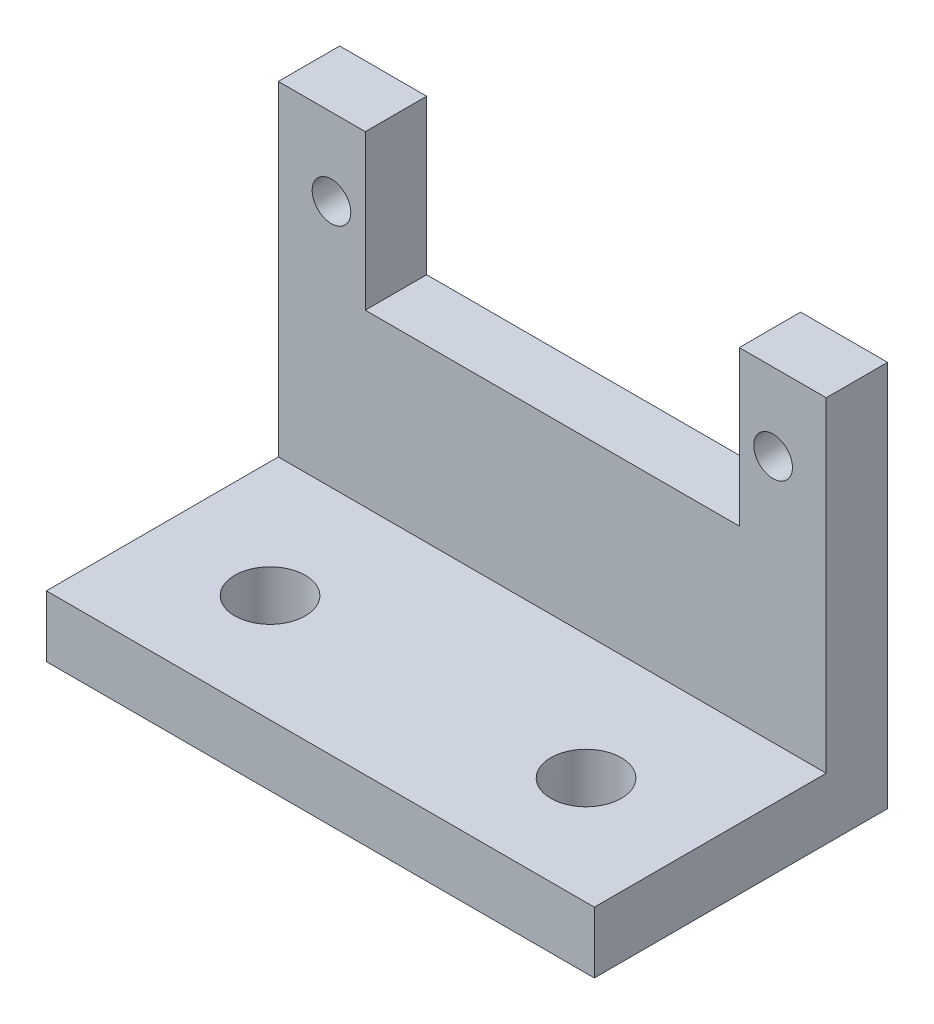
ISO-10303-21;
HEADER;
FILE_DESCRIPTION(('STEP AP214'),'2;1');
FILE_NAME('part.step','',(''),(''),'','','');
FILE_SCHEMA(('AUTOMOTIVE_DESIGN { 1 0 10303 214 1 1 1 1 }'));
ENDSEC;
DATA;
#1=APPLICATION_CONTEXT('core data for automotive mechanical design processes');
#2=APPLICATION_PROTOCOL_DEFINITION('international standard','automotive_design',2000,#1);
#3=PRODUCT_CONTEXT('',#1,'mechanical');
#4=PRODUCT('Part','Part','',(#3));
#5=PRODUCT_RELATED_PRODUCT_CATEGORY('part','',(#4));
#6=PRODUCT_DEFINITION_FORMATION('','',#4);
#7=PRODUCT_DEFINITION_CONTEXT('part definition',#1,'design');
#8=PRODUCT_DEFINITION('design','',#6,#7);
#9=PRODUCT_DEFINITION_SHAPE('','',#8);
#10=(LENGTH_UNIT() NAMED_UNIT(*) SI_UNIT(.MILLI.,.METRE.));
#11=(NAMED_UNIT(*) PLANE_ANGLE_UNIT() SI_UNIT($,.RADIAN.));
#12=(NAMED_UNIT(*) SI_UNIT($,.STERADIAN.) SOLID_ANGLE_UNIT());
#13=UNCERTAINTY_MEASURE_WITH_UNIT(LENGTH_MEASURE(1.E-05),#10,'distance_accuracy_value','');
#14=(GEOMETRIC_REPRESENTATION_CONTEXT(3) GLOBAL_UNCERTAINTY_ASSIGNED_CONTEXT((#13)) GLOBAL_UNIT_ASSIGNED_CONTEXT((#10,
#11,#12)) REPRESENTATION_CONTEXT('',''));
#15=CARTESIAN_POINT('',(0.,0.,0.));
#16=DIRECTION('',(0.,0.,1.));
#17=DIRECTION('',(1.,0.,0.));
#18=AXIS2_PLACEMENT_3D('',#15,#16,#17);
#19=CARTESIAN_POINT('',(0.,0.,3.175));
#20=DIRECTION('',(0.,0.,-1.));
#21=DIRECTION('',(-1.,0.,0.));
#22=AXIS2_PLACEMENT_3D('',#19,#20,#21);
#23=PLANE('',#22);
#24=CARTESIAN_POINT('',(25.6,4.,3.175));
#25=DIRECTION('',(0.,0.,1.));
#26=DIRECTION('',(1.,0.,0.));
#27=AXIS2_PLACEMENT_3D('',#24,#25,#26);
#28=CIRCLE('',#27,0.999999999999998);
#29=CARTESIAN_POINT('',(26.6,4.,3.175));
#30=VERTEX_POINT('',#29);
#31=EDGE_CURVE('E214',#30,#30,#28,.T.);
#32=ORIENTED_EDGE('',*,*,#31,.F.);
#33=EDGE_LOOP('',(#32));
#34=FACE_BOUND('',#33,.T.);
#35=CARTESIAN_POINT('',(2.75,4.,3.175));
#36=DIRECTION('',(0.,0.,1.));
#37=DIRECTION('',(1.,0.,0.));
#38=AXIS2_PLACEMENT_3D('',#35,#36,#37);
#39=CIRCLE('',#38,1.);
#40=CARTESIAN_POINT('',(3.75,4.,3.175));
#41=VERTEX_POINT('',#40);
#42=EDGE_CURVE('E139',#41,#41,#39,.T.);
#43=ORIENTED_EDGE('',*,*,#42,.F.);
#44=EDGE_LOOP('',(#43));
#45=FACE_BOUND('',#44,.T.);
#46=DIRECTION('',(-1.,0.,0.));
#47=VECTOR('',#46,1.);
#48=CARTESIAN_POINT('',(0.,-8.825,3.175));
#49=LINE('',#48,#47);
#50=CARTESIAN_POINT('',(28.35,-8.825,3.175));
#51=VERTEX_POINT('',#50);
#52=CARTESIAN_POINT('',(0.,-8.825,3.175));
#53=VERTEX_POINT('',#52);
#54=EDGE_CURVE('E50',#51,#53,#49,.T.);
#55=ORIENTED_EDGE('',*,*,#54,.F.);
#56=DIRECTION('',(0.,1.,0.));
#57=VECTOR('',#56,1.);
#58=CARTESIAN_POINT('',(28.35,8.,3.175));
#59=LINE('',#58,#57);
#60=CARTESIAN_POINT('',(28.35,8.,3.175));
#61=VERTEX_POINT('',#60);
#62=EDGE_CURVE('E165',#51,#61,#59,.T.);
#63=ORIENTED_EDGE('',*,*,#62,.T.);
#64=DIRECTION('',(-1.,0.,0.));
#65=VECTOR('',#64,1.);
#66=CARTESIAN_POINT('',(23.85,8.,3.175));
#67=LINE('',#66,#65);
#68=CARTESIAN_POINT('',(23.85,8.,3.175));
#69=VERTEX_POINT('',#68);
#70=EDGE_CURVE('E114',#61,#69,#67,.T.);
#71=ORIENTED_EDGE('',*,*,#70,.T.);
#72=DIRECTION('',(0.,-1.,0.));
#73=VECTOR('',#72,1.);
#74=CARTESIAN_POINT('',(23.85,0.,3.175));
#75=LINE('',#74,#73);
#76=CARTESIAN_POINT('',(23.85,0.,3.175));
#77=VERTEX_POINT('',#76);
#78=EDGE_CURVE('E108',#69,#77,#75,.T.);
#79=ORIENTED_EDGE('',*,*,#78,.T.);
#80=DIRECTION('',(-1.,0.,0.));
#81=VECTOR('',#80,1.);
#82=CARTESIAN_POINT('',(4.5,0.,3.175));
#83=LINE('',#82,#81);
#84=CARTESIAN_POINT('',(4.5,0.,3.175));
#85=VERTEX_POINT('',#84);
#86=EDGE_CURVE('E111',#77,#85,#83,.T.);
#87=ORIENTED_EDGE('',*,*,#86,.T.);
#88=DIRECTION('',(0.,1.,0.));
#89=VECTOR('',#88,1.);
#90=CARTESIAN_POINT('',(4.5,8.,3.175));
#91=LINE('',#90,#89);
#92=CARTESIAN_POINT('',(4.5,8.,3.175));
#93=VERTEX_POINT('',#92);
#94=EDGE_CURVE('E58',#85,#93,#91,.T.);
#95=ORIENTED_EDGE('',*,*,#94,.T.);
#96=DIRECTION('',(-1.,0.,0.));
#97=VECTOR('',#96,1.);
#98=CARTESIAN_POINT('',(0.,8.,3.175));
#99=LINE('',#98,#97);
#100=CARTESIAN_POINT('',(0.,8.,3.175));
#101=VERTEX_POINT('',#100);
#102=EDGE_CURVE('E151',#93,#101,#99,.T.);
#103=ORIENTED_EDGE('',*,*,#102,.T.);
#104=DIRECTION('',(0.,-1.,0.));
#105=VECTOR('',#104,1.);
#106=CARTESIAN_POINT('',(0.,8.,3.175));
#107=LINE('',#106,#105);
#108=EDGE_CURVE('E98',#101,#53,#107,.T.);
#109=ORIENTED_EDGE('',*,*,#108,.T.);
#110=EDGE_LOOP('',(#55,#63,#71,#79,#87,#95,#103,#109));
#111=FACE_BOUND('',#110,.T.);
#112=ADVANCED_FACE('F33',(#34,#45,#111),#23,.F.);
#113=CARTESIAN_POINT('',(0.,0.,0.));
#114=DIRECTION('',(0.,0.,-1.));
#115=DIRECTION('',(-1.,0.,0.));
#116=AXIS2_PLACEMENT_3D('',#113,#114,#115);
#117=PLANE('',#116);
#118=CARTESIAN_POINT('',(2.75,4.,0.));
#119=DIRECTION('',(0.,0.,1.));
#120=DIRECTION('',(1.,0.,0.));
#121=AXIS2_PLACEMENT_3D('',#118,#119,#120);
#122=CIRCLE('',#121,1.);
#123=CARTESIAN_POINT('',(3.75,4.,0.));
#124=VERTEX_POINT('',#123);
#125=EDGE_CURVE('E217',#124,#124,#122,.T.);
#126=ORIENTED_EDGE('',*,*,#125,.T.);
#127=EDGE_LOOP('',(#126));
#128=FACE_BOUND('',#127,.T.);
#129=DIRECTION('',(-1.,0.,0.));
#130=VECTOR('',#129,1.);
#131=CARTESIAN_POINT('',(0.,8.,0.));
#132=LINE('',#131,#130);
#133=CARTESIAN_POINT('',(4.5,8.,0.));
#134=VERTEX_POINT('',#133);
#135=CARTESIAN_POINT('',(0.,8.,0.));
#136=VERTEX_POINT('',#135);
#137=EDGE_CURVE('E135',#134,#136,#132,.T.);
#138=ORIENTED_EDGE('',*,*,#137,.F.);
#139=DIRECTION('',(0.,1.,0.));
#140=VECTOR('',#139,1.);
#141=CARTESIAN_POINT('',(4.5,8.,0.));
#142=LINE('',#141,#140);
#143=CARTESIAN_POINT('',(4.5,0.,0.));
#144=VERTEX_POINT('',#143);
#145=EDGE_CURVE('E91',#144,#134,#142,.T.);
#146=ORIENTED_EDGE('',*,*,#145,.F.);
#147=DIRECTION('',(-1.,0.,0.));
#148=VECTOR('',#147,1.);
#149=CARTESIAN_POINT('',(4.5,0.,0.));
#150=LINE('',#149,#148);
#151=CARTESIAN_POINT('',(23.85,0.,0.));
#152=VERTEX_POINT('',#151);
#153=EDGE_CURVE('E148',#152,#144,#150,.T.);
#154=ORIENTED_EDGE('',*,*,#153,.F.);
#155=DIRECTION('',(0.,-1.,0.));
#156=VECTOR('',#155,1.);
#157=CARTESIAN_POINT('',(23.85,0.,0.));
#158=LINE('',#157,#156);
#159=CARTESIAN_POINT('',(23.85,8.,0.));
#160=VERTEX_POINT('',#159);
#161=EDGE_CURVE('E123',#160,#152,#158,.T.);
#162=ORIENTED_EDGE('',*,*,#161,.F.);
#163=DIRECTION('',(-1.,0.,0.));
#164=VECTOR('',#163,1.);
#165=CARTESIAN_POINT('',(23.85,8.,0.));
#166=LINE('',#165,#164);
#167=CARTESIAN_POINT('',(28.35,8.,0.));
#168=VERTEX_POINT('',#167);
#169=EDGE_CURVE('E145',#168,#160,#166,.T.);
#170=ORIENTED_EDGE('',*,*,#169,.F.);
#171=DIRECTION('',(0.,1.,0.));
#172=VECTOR('',#171,1.);
#173=CARTESIAN_POINT('',(28.35,8.,0.));
#174=LINE('',#173,#172);
#175=CARTESIAN_POINT('',(28.35,-12.,0.));
#176=VERTEX_POINT('',#175);
#177=EDGE_CURVE('E143',#176,#168,#174,.T.);
#178=ORIENTED_EDGE('',*,*,#177,.F.);
#179=DIRECTION('',(1.,0.,0.));
#180=VECTOR('',#179,1.);
#181=CARTESIAN_POINT('',(28.35,-12.,0.));
#182=LINE('',#181,#180);
#183=CARTESIAN_POINT('',(0.,-12.,0.));
#184=VERTEX_POINT('',#183);
#185=EDGE_CURVE('E141',#184,#176,#182,.T.);
#186=ORIENTED_EDGE('',*,*,#185,.F.);
#187=DIRECTION('',(0.,-1.,0.));
#188=VECTOR('',#187,1.);
#189=CARTESIAN_POINT('',(0.,-12.,0.));
#190=LINE('',#189,#188);
#191=EDGE_CURVE('E138',#136,#184,#190,.T.);
#192=ORIENTED_EDGE('',*,*,#191,.F.);
#193=EDGE_LOOP('',(#138,#146,#154,#162,#170,#178,#186,#192));
#194=FACE_BOUND('',#193,.T.);
#195=CARTESIAN_POINT('',(25.6,4.,0.));
#196=DIRECTION('',(0.,0.,1.));
#197=DIRECTION('',(1.,0.,0.));
#198=AXIS2_PLACEMENT_3D('',#195,#196,#197);
#199=CIRCLE('',#198,0.999999999999998);
#200=CARTESIAN_POINT('',(26.6,4.,0.));
#201=VERTEX_POINT('',#200);
#202=EDGE_CURVE('E204',#201,#201,#199,.T.);
#203=ORIENTED_EDGE('',*,*,#202,.T.);
#204=EDGE_LOOP('',(#203));
#205=FACE_BOUND('',#204,.T.);
#206=ADVANCED_FACE('F183',(#128,#194,#205),#117,.T.);
#207=CARTESIAN_POINT('',(0.,8.,3.175));
#208=DIRECTION('',(0.,-1.,0.));
#209=DIRECTION('',(0.,0.,-1.));
#210=AXIS2_PLACEMENT_3D('',#207,#208,#209);
#211=PLANE('',#210);
#212=ORIENTED_EDGE('',*,*,#137,.T.);
#213=DIRECTION('',(0.,0.,-1.));
#214=VECTOR('',#213,1.);
#215=CARTESIAN_POINT('',(0.,8.,3.175));
#216=LINE('',#215,#214);
#217=EDGE_CURVE('E11',#101,#136,#216,.T.);
#218=ORIENTED_EDGE('',*,*,#217,.F.);
#219=ORIENTED_EDGE('',*,*,#102,.F.);
#220=DIRECTION('',(0.,0.,-1.));
#221=VECTOR('',#220,1.);
#222=CARTESIAN_POINT('',(4.5,8.,3.175));
#223=LINE('',#222,#221);
#224=EDGE_CURVE('E131',#93,#134,#223,.T.);
#225=ORIENTED_EDGE('',*,*,#224,.T.);
#226=EDGE_LOOP('',(#212,#218,#219,#225));
#227=FACE_BOUND('',#226,.T.);
#228=ADVANCED_FACE('F35',(#227),#211,.F.);
#229=CARTESIAN_POINT('',(0.,-12.,3.175));
#230=DIRECTION('',(1.,0.,0.));
#231=DIRECTION('',(0.,0.,-1.));
#232=AXIS2_PLACEMENT_3D('',#229,#230,#231);
#233=PLANE('',#232);
#234=ORIENTED_EDGE('',*,*,#191,.T.);
#235=DIRECTION('',(0.,0.,-1.));
#236=VECTOR('',#235,1.);
#237=CARTESIAN_POINT('',(0.,-12.,3.175));
#238=LINE('',#237,#236);
#239=CARTESIAN_POINT('',(0.,-12.,15.175));
#240=VERTEX_POINT('',#239);
#241=EDGE_CURVE('E42',#240,#184,#238,.T.);
#242=ORIENTED_EDGE('',*,*,#241,.F.);
#243=DIRECTION('',(0.,-1.,0.));
#244=VECTOR('',#243,1.);
#245=CARTESIAN_POINT('',(0.,-12.,15.175));
#246=LINE('',#245,#244);
#247=CARTESIAN_POINT('',(0.,-8.825,15.175));
#248=VERTEX_POINT('',#247);
#249=EDGE_CURVE('E197',#248,#240,#246,.T.);
#250=ORIENTED_EDGE('',*,*,#249,.F.);
#251=DIRECTION('',(0.,0.,-1.));
#252=VECTOR('',#251,1.);
#253=CARTESIAN_POINT('',(0.,-8.825,15.175));
#254=LINE('',#253,#252);
#255=EDGE_CURVE('E194',#248,#53,#254,.T.);
#256=ORIENTED_EDGE('',*,*,#255,.T.);
#257=ORIENTED_EDGE('',*,*,#108,.F.);
#258=ORIENTED_EDGE('',*,*,#217,.T.);
#259=EDGE_LOOP('',(#234,#242,#250,#256,#257,#258));
#260=FACE_BOUND('',#259,.T.);
#261=ADVANCED_FACE('F199',(#260),#233,.F.);
#262=CARTESIAN_POINT('',(28.35,-12.,3.175));
#263=DIRECTION('',(0.,1.,0.));
#264=DIRECTION('',(-1.,0.,0.));
#265=AXIS2_PLACEMENT_3D('',#262,#263,#264);
#266=PLANE('',#265);
#267=CARTESIAN_POINT('',(22.35,-12.,9.60325543));
#268=DIRECTION('',(0.,1.,0.));
#269=DIRECTION('',(-1.,0.,0.));
#270=AXIS2_PLACEMENT_3D('',#267,#268,#269);
#271=CIRCLE('',#270,1.825);
#272=CARTESIAN_POINT('',(20.525,-12.,9.60325543));
#273=VERTEX_POINT('',#272);
#274=EDGE_CURVE('E377',#273,#273,#271,.F.);
#275=ORIENTED_EDGE('',*,*,#274,.F.);
#276=EDGE_LOOP('',(#275));
#277=FACE_BOUND('',#276,.T.);
#278=CARTESIAN_POINT('',(6.,-12.,9.60325543));
#279=DIRECTION('',(0.,1.,0.));
#280=DIRECTION('',(-1.,0.,0.));
#281=AXIS2_PLACEMENT_3D('',#278,#279,#280);
#282=CIRCLE('',#281,1.825);
#283=CARTESIAN_POINT('',(4.175,-12.,9.60325543));
#284=VERTEX_POINT('',#283);
#285=EDGE_CURVE('E198',#284,#284,#282,.F.);
#286=ORIENTED_EDGE('',*,*,#285,.F.);
#287=EDGE_LOOP('',(#286));
#288=FACE_BOUND('',#287,.T.);
#289=ORIENTED_EDGE('',*,*,#185,.T.);
#290=DIRECTION('',(0.,0.,-1.));
#291=VECTOR('',#290,1.);
#292=CARTESIAN_POINT('',(28.35,-12.,3.175));
#293=LINE('',#292,#291);
#294=CARTESIAN_POINT('',(28.35,-12.,15.175));
#295=VERTEX_POINT('',#294);
#296=EDGE_CURVE('E158',#295,#176,#293,.T.);
#297=ORIENTED_EDGE('',*,*,#296,.F.);
#298=DIRECTION('',(1.,0.,0.));
#299=VECTOR('',#298,1.);
#300=CARTESIAN_POINT('',(0.,-12.,15.175));
#301=LINE('',#300,#299);
#302=EDGE_CURVE('E390',#240,#295,#301,.T.);
#303=ORIENTED_EDGE('',*,*,#302,.F.);
#304=ORIENTED_EDGE('',*,*,#241,.T.);
#305=EDGE_LOOP('',(#289,#297,#303,#304));
#306=FACE_BOUND('',#305,.T.);
#307=ADVANCED_FACE('F255',(#277,#288,#306),#266,.F.);
#308=CARTESIAN_POINT('',(28.35,8.,3.175));
#309=DIRECTION('',(-1.,0.,0.));
#310=DIRECTION('',(0.,-1.,0.));
#311=AXIS2_PLACEMENT_3D('',#308,#309,#310);
#312=PLANE('',#311);
#313=ORIENTED_EDGE('',*,*,#177,.T.);
#314=DIRECTION('',(0.,0.,-1.));
#315=VECTOR('',#314,1.);
#316=CARTESIAN_POINT('',(28.35,8.,3.175));
#317=LINE('',#316,#315);
#318=EDGE_CURVE('E155',#61,#168,#317,.T.);
#319=ORIENTED_EDGE('',*,*,#318,.F.);
#320=ORIENTED_EDGE('',*,*,#62,.F.);
#321=DIRECTION('',(0.,0.,-1.));
#322=VECTOR('',#321,1.);
#323=CARTESIAN_POINT('',(28.35,-8.825,15.175));
#324=LINE('',#323,#322);
#325=CARTESIAN_POINT('',(28.35,-8.825,15.175));
#326=VERTEX_POINT('',#325);
#327=EDGE_CURVE('E196',#326,#51,#324,.T.);
#328=ORIENTED_EDGE('',*,*,#327,.F.);
#329=DIRECTION('',(0.,1.,0.));
#330=VECTOR('',#329,1.);
#331=CARTESIAN_POINT('',(28.35,-12.,15.175));
#332=LINE('',#331,#330);
#333=EDGE_CURVE('E206',#295,#326,#332,.T.);
#334=ORIENTED_EDGE('',*,*,#333,.F.);
#335=ORIENTED_EDGE('',*,*,#296,.T.);
#336=EDGE_LOOP('',(#313,#319,#320,#328,#334,#335));
#337=FACE_BOUND('',#336,.T.);
#338=ADVANCED_FACE('F176',(#337),#312,.F.);
#339=CARTESIAN_POINT('',(23.85,8.,3.175));
#340=DIRECTION('',(0.,-1.,0.));
#341=DIRECTION('',(0.,0.,-1.));
#342=AXIS2_PLACEMENT_3D('',#339,#340,#341);
#343=PLANE('',#342);
#344=ORIENTED_EDGE('',*,*,#169,.T.);
#345=DIRECTION('',(0.,0.,-1.));
#346=VECTOR('',#345,1.);
#347=CARTESIAN_POINT('',(23.85,8.,3.175));
#348=LINE('',#347,#346);
#349=EDGE_CURVE('E126',#69,#160,#348,.T.);
#350=ORIENTED_EDGE('',*,*,#349,.F.);
#351=ORIENTED_EDGE('',*,*,#70,.F.);
#352=ORIENTED_EDGE('',*,*,#318,.T.);
#353=EDGE_LOOP('',(#344,#350,#351,#352));
#354=FACE_BOUND('',#353,.T.);
#355=ADVANCED_FACE('F180',(#354),#343,.F.);
#356=CARTESIAN_POINT('',(23.85,0.,3.175));
#357=DIRECTION('',(1.,0.,0.));
#358=DIRECTION('',(0.,0.,-1.));
#359=AXIS2_PLACEMENT_3D('',#356,#357,#358);
#360=PLANE('',#359);
#361=ORIENTED_EDGE('',*,*,#161,.T.);
#362=DIRECTION('',(0.,0.,-1.));
#363=VECTOR('',#362,1.);
#364=CARTESIAN_POINT('',(23.85,0.,3.175));
#365=LINE('',#364,#363);
#366=EDGE_CURVE('E120',#77,#152,#365,.T.);
#367=ORIENTED_EDGE('',*,*,#366,.F.);
#368=ORIENTED_EDGE('',*,*,#78,.F.);
#369=ORIENTED_EDGE('',*,*,#349,.T.);
#370=EDGE_LOOP('',(#361,#367,#368,#369));
#371=FACE_BOUND('',#370,.T.);
#372=ADVANCED_FACE('F121',(#371),#360,.F.);
#373=CARTESIAN_POINT('',(4.5,0.,3.175));
#374=DIRECTION('',(0.,-1.,0.));
#375=DIRECTION('',(0.,0.,-1.));
#376=AXIS2_PLACEMENT_3D('',#373,#374,#375);
#377=PLANE('',#376);
#378=ORIENTED_EDGE('',*,*,#153,.T.);
#379=DIRECTION('',(0.,0.,-1.));
#380=VECTOR('',#379,1.);
#381=CARTESIAN_POINT('',(4.5,0.,3.175));
#382=LINE('',#381,#380);
#383=EDGE_CURVE('E127',#85,#144,#382,.T.);
#384=ORIENTED_EDGE('',*,*,#383,.F.);
#385=ORIENTED_EDGE('',*,*,#86,.F.);
#386=ORIENTED_EDGE('',*,*,#366,.T.);
#387=EDGE_LOOP('',(#378,#384,#385,#386));
#388=FACE_BOUND('',#387,.T.);
#389=ADVANCED_FACE('F129',(#388),#377,.F.);
#390=CARTESIAN_POINT('',(4.5,8.,3.175));
#391=DIRECTION('',(-1.,0.,0.));
#392=DIRECTION('',(0.,0.,1.));
#393=AXIS2_PLACEMENT_3D('',#390,#391,#392);
#394=PLANE('',#393);
#395=ORIENTED_EDGE('',*,*,#145,.T.);
#396=ORIENTED_EDGE('',*,*,#224,.F.);
#397=ORIENTED_EDGE('',*,*,#94,.F.);
#398=ORIENTED_EDGE('',*,*,#383,.T.);
#399=EDGE_LOOP('',(#395,#396,#397,#398));
#400=FACE_BOUND('',#399,.T.);
#401=ADVANCED_FACE('F185',(#400),#394,.F.);
#402=CARTESIAN_POINT('',(2.75,4.,3.175));
#403=DIRECTION('',(0.,0.,-1.));
#404=DIRECTION('',(-1.,0.,0.));
#405=AXIS2_PLACEMENT_3D('',#402,#403,#404);
#406=CYLINDRICAL_SURFACE('',#405,1.);
#407=ORIENTED_EDGE('',*,*,#42,.T.);
#408=EDGE_LOOP('',(#407));
#409=FACE_BOUND('',#408,.T.);
#410=ORIENTED_EDGE('',*,*,#125,.F.);
#411=EDGE_LOOP('',(#410));
#412=FACE_BOUND('',#411,.T.);
#413=ADVANCED_FACE('F225',(#409,#412),#406,.F.);
#414=CARTESIAN_POINT('',(25.6,4.,3.175));
#415=DIRECTION('',(0.,0.,-1.));
#416=DIRECTION('',(-1.,0.,0.));
#417=AXIS2_PLACEMENT_3D('',#414,#415,#416);
#418=CYLINDRICAL_SURFACE('',#417,0.999999999999998);
#419=ORIENTED_EDGE('',*,*,#31,.T.);
#420=EDGE_LOOP('',(#419));
#421=FACE_BOUND('',#420,.T.);
#422=ORIENTED_EDGE('',*,*,#202,.F.);
#423=EDGE_LOOP('',(#422));
#424=FACE_BOUND('',#423,.T.);
#425=ADVANCED_FACE('F227',(#421,#424),#418,.F.);
#426=CARTESIAN_POINT('',(0.,-8.825,15.175));
#427=DIRECTION('',(0.,-1.,0.));
#428=DIRECTION('',(0.,0.,-1.));
#429=AXIS2_PLACEMENT_3D('',#426,#427,#428);
#430=PLANE('',#429);
#431=CARTESIAN_POINT('',(22.35,-8.825,9.60325543));
#432=DIRECTION('',(0.,1.,0.));
#433=DIRECTION('',(0.,0.,1.));
#434=AXIS2_PLACEMENT_3D('',#431,#432,#433);
#435=CIRCLE('',#434,1.825);
#436=CARTESIAN_POINT('',(22.35,-8.825,11.42825543));
#437=VERTEX_POINT('',#436);
#438=EDGE_CURVE('E380',#437,#437,#435,.T.);
#439=ORIENTED_EDGE('',*,*,#438,.F.);
#440=EDGE_LOOP('',(#439));
#441=FACE_BOUND('',#440,.T.);
#442=CARTESIAN_POINT('',(6.,-8.825,9.60325543));
#443=DIRECTION('',(0.,1.,0.));
#444=DIRECTION('',(0.,0.,1.));
#445=AXIS2_PLACEMENT_3D('',#442,#443,#444);
#446=CIRCLE('',#445,1.825);
#447=CARTESIAN_POINT('',(6.,-8.825,11.42825543));
#448=VERTEX_POINT('',#447);
#449=EDGE_CURVE('E382',#448,#448,#446,.T.);
#450=ORIENTED_EDGE('',*,*,#449,.F.);
#451=EDGE_LOOP('',(#450));
#452=FACE_BOUND('',#451,.T.);
#453=ORIENTED_EDGE('',*,*,#54,.T.);
#454=ORIENTED_EDGE('',*,*,#255,.F.);
#455=DIRECTION('',(-1.,0.,0.));
#456=VECTOR('',#455,1.);
#457=CARTESIAN_POINT('',(0.,-8.825,15.175));
#458=LINE('',#457,#456);
#459=EDGE_CURVE('E202',#326,#248,#458,.T.);
#460=ORIENTED_EDGE('',*,*,#459,.F.);
#461=ORIENTED_EDGE('',*,*,#327,.T.);
#462=EDGE_LOOP('',(#453,#454,#460,#461));
#463=FACE_BOUND('',#462,.T.);
#464=ADVANCED_FACE('F192',(#441,#452,#463),#430,.F.);
#465=CARTESIAN_POINT('',(0.,0.,15.175));
#466=DIRECTION('',(0.,0.,-1.));
#467=DIRECTION('',(-1.,0.,0.));
#468=AXIS2_PLACEMENT_3D('',#465,#466,#467);
#469=PLANE('',#468);
#470=ORIENTED_EDGE('',*,*,#249,.T.);
#471=ORIENTED_EDGE('',*,*,#302,.T.);
#472=ORIENTED_EDGE('',*,*,#333,.T.);
#473=ORIENTED_EDGE('',*,*,#459,.T.);
#474=EDGE_LOOP('',(#470,#471,#472,#473));
#475=FACE_BOUND('',#474,.T.);
#476=ADVANCED_FACE('F335',(#475),#469,.F.);
#477=CARTESIAN_POINT('',(6.,-17.1618795026618,9.60325543));
#478=DIRECTION('',(0.,1.,0.));
#479=DIRECTION('',(0.,0.,1.));
#480=AXIS2_PLACEMENT_3D('',#477,#478,#479);
#481=CYLINDRICAL_SURFACE('',#480,1.825);
#482=ORIENTED_EDGE('',*,*,#285,.T.);
#483=EDGE_LOOP('',(#482));
#484=FACE_BOUND('',#483,.T.);
#485=ORIENTED_EDGE('',*,*,#449,.T.);
#486=EDGE_LOOP('',(#485));
#487=FACE_BOUND('',#486,.T.);
#488=ADVANCED_FACE('F339',(#484,#487),#481,.F.);
#489=CARTESIAN_POINT('',(22.35,-17.1618795026618,9.60325543));
#490=DIRECTION('',(0.,1.,0.));
#491=DIRECTION('',(0.,0.,1.));
#492=AXIS2_PLACEMENT_3D('',#489,#490,#491);
#493=CYLINDRICAL_SURFACE('',#492,1.825);
#494=ORIENTED_EDGE('',*,*,#274,.T.);
#495=EDGE_LOOP('',(#494));
#496=FACE_BOUND('',#495,.T.);
#497=ORIENTED_EDGE('',*,*,#438,.T.);
#498=EDGE_LOOP('',(#497));
#499=FACE_BOUND('',#498,.T.);
#500=ADVANCED_FACE('F360',(#496,#499),#493,.F.);
#501=CLOSED_SHELL('',(#112,#206,#228,#261,#307,#338,#355,#372,#389,#401,#413,#425,#464,#476,
#488,#500));
#502=MANIFOLD_SOLID_BREP('B2',#501);
#503=ADVANCED_BREP_SHAPE_REPRESENTATION('',(#18,#502),#14);
#504=SHAPE_DEFINITION_REPRESENTATION(#9,#503);
ENDSEC;
END-ISO-10303-21;
